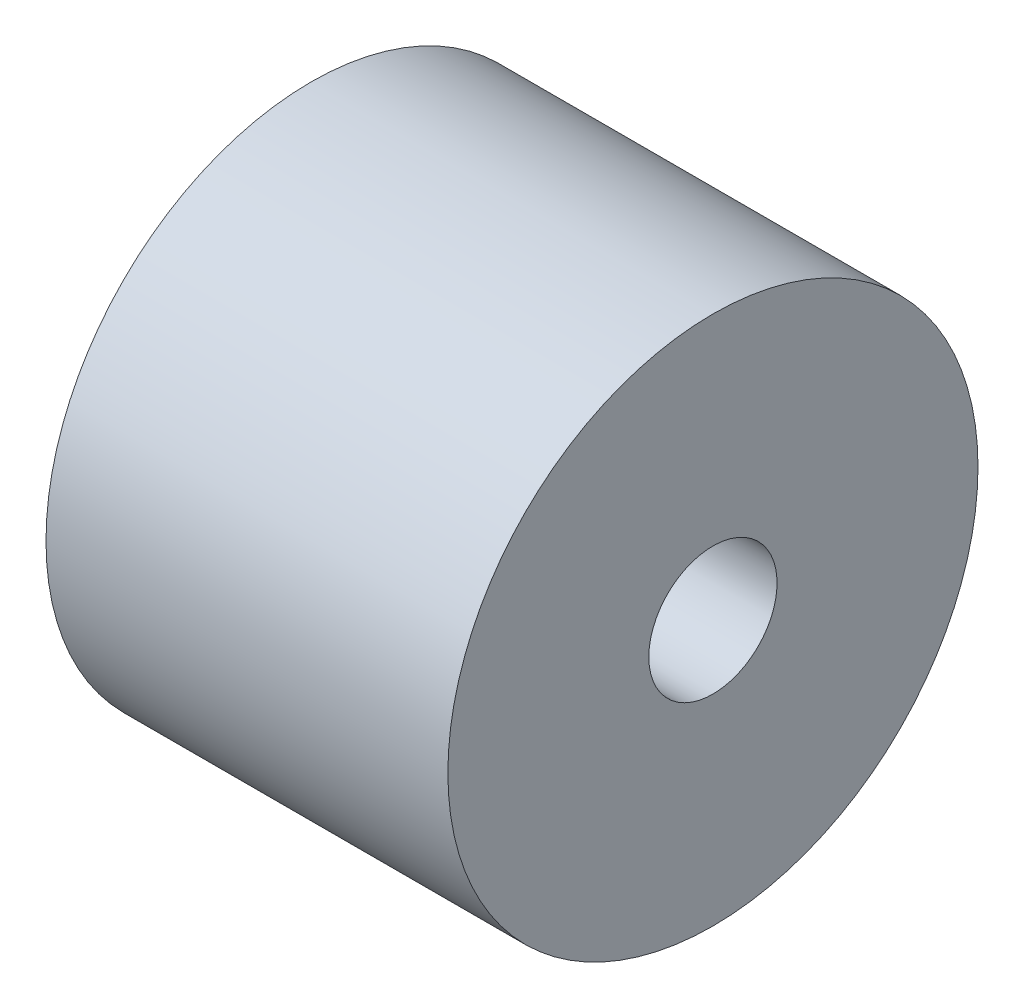
ISO-10303-21;
HEADER;
FILE_DESCRIPTION(('STEP AP214'),'2;1');
FILE_NAME('part.step','',(''),(''),'','','');
FILE_SCHEMA(('AUTOMOTIVE_DESIGN { 1 0 10303 214 1 1 1 1 }'));
ENDSEC;
DATA;
#1=APPLICATION_CONTEXT('core data for automotive mechanical design processes');
#2=APPLICATION_PROTOCOL_DEFINITION('international standard','automotive_design',2000,#1);
#3=PRODUCT_CONTEXT('',#1,'mechanical');
#4=PRODUCT('Part','Part','',(#3));
#5=PRODUCT_RELATED_PRODUCT_CATEGORY('part','',(#4));
#6=PRODUCT_DEFINITION_FORMATION('','',#4);
#7=PRODUCT_DEFINITION_CONTEXT('part definition',#1,'design');
#8=PRODUCT_DEFINITION('design','',#6,#7);
#9=PRODUCT_DEFINITION_SHAPE('','',#8);
#10=(LENGTH_UNIT() NAMED_UNIT(*) SI_UNIT(.MILLI.,.METRE.));
#11=(NAMED_UNIT(*) PLANE_ANGLE_UNIT() SI_UNIT($,.RADIAN.));
#12=(NAMED_UNIT(*) SI_UNIT($,.STERADIAN.) SOLID_ANGLE_UNIT());
#13=UNCERTAINTY_MEASURE_WITH_UNIT(LENGTH_MEASURE(1.E-05),#10,'distance_accuracy_value','');
#14=(GEOMETRIC_REPRESENTATION_CONTEXT(3) GLOBAL_UNCERTAINTY_ASSIGNED_CONTEXT((#13)) GLOBAL_UNIT_ASSIGNED_CONTEXT((#10,
#11,#12)) REPRESENTATION_CONTEXT('',''));
#15=CARTESIAN_POINT('',(0.,0.,0.));
#16=DIRECTION('',(0.,0.,1.));
#17=DIRECTION('',(1.,0.,0.));
#18=AXIS2_PLACEMENT_3D('',#15,#16,#17);
#19=CARTESIAN_POINT('',(9.4,0.,0.));
#20=DIRECTION('',(-1.,0.,0.));
#21=DIRECTION('',(0.,0.,1.));
#22=AXIS2_PLACEMENT_3D('',#19,#20,#21);
#23=CYLINDRICAL_SURFACE('',#22,6.20000000000001);
#24=CARTESIAN_POINT('',(9.4,0.,0.));
#25=DIRECTION('',(1.,0.,0.));
#26=DIRECTION('',(0.,0.,-1.));
#27=AXIS2_PLACEMENT_3D('',#24,#25,#26);
#28=CIRCLE('',#27,6.20000000000001);
#29=CARTESIAN_POINT('',(9.4,0.,-6.20000000000001));
#30=VERTEX_POINT('',#29);
#31=EDGE_CURVE('E10',#30,#30,#28,.T.);
#32=ORIENTED_EDGE('',*,*,#31,.F.);
#33=EDGE_LOOP('',(#32));
#34=FACE_BOUND('',#33,.T.);
#35=CARTESIAN_POINT('',(0.,0.,0.));
#36=DIRECTION('',(1.,0.,0.));
#37=DIRECTION('',(0.,0.,-1.));
#38=AXIS2_PLACEMENT_3D('',#35,#36,#37);
#39=CIRCLE('',#38,6.20000000000001);
#40=CARTESIAN_POINT('',(0.,0.,-6.20000000000001));
#41=VERTEX_POINT('',#40);
#42=EDGE_CURVE('E38',#41,#41,#39,.T.);
#43=ORIENTED_EDGE('',*,*,#42,.T.);
#44=EDGE_LOOP('',(#43));
#45=FACE_BOUND('',#44,.T.);
#46=ADVANCED_FACE('F35',(#34,#45),#23,.T.);
#47=CARTESIAN_POINT('',(9.4,0.,0.));
#48=DIRECTION('',(1.,0.,0.));
#49=DIRECTION('',(0.,0.,-1.));
#50=AXIS2_PLACEMENT_3D('',#47,#48,#49);
#51=PLANE('',#50);
#52=CARTESIAN_POINT('',(9.4,0.,0.));
#53=DIRECTION('',(-1.,0.,0.));
#54=DIRECTION('',(0.,0.,1.));
#55=AXIS2_PLACEMENT_3D('',#52,#53,#54);
#56=CIRCLE('',#55,1.5);
#57=CARTESIAN_POINT('',(9.4,0.,1.5));
#58=VERTEX_POINT('',#57);
#59=EDGE_CURVE('E45',#58,#58,#56,.T.);
#60=ORIENTED_EDGE('',*,*,#59,.T.);
#61=EDGE_LOOP('',(#60));
#62=FACE_BOUND('',#61,.T.);
#63=ORIENTED_EDGE('',*,*,#31,.T.);
#64=EDGE_LOOP('',(#63));
#65=FACE_BOUND('',#64,.T.);
#66=ADVANCED_FACE('F53',(#62,#65),#51,.T.);
#67=CARTESIAN_POINT('',(0.,0.,0.));
#68=DIRECTION('',(1.,0.,0.));
#69=DIRECTION('',(0.,0.,-1.));
#70=AXIS2_PLACEMENT_3D('',#67,#68,#69);
#71=PLANE('',#70);
#72=CARTESIAN_POINT('',(0.,0.,0.));
#73=DIRECTION('',(-1.,0.,0.));
#74=DIRECTION('',(0.,0.,1.));
#75=AXIS2_PLACEMENT_3D('',#72,#73,#74);
#76=CIRCLE('',#75,1.5);
#77=CARTESIAN_POINT('',(0.,0.,1.5));
#78=VERTEX_POINT('',#77);
#79=EDGE_CURVE('E47',#78,#78,#76,.T.);
#80=ORIENTED_EDGE('',*,*,#79,.F.);
#81=EDGE_LOOP('',(#80));
#82=FACE_BOUND('',#81,.T.);
#83=ORIENTED_EDGE('',*,*,#42,.F.);
#84=EDGE_LOOP('',(#83));
#85=FACE_BOUND('',#84,.T.);
#86=ADVANCED_FACE('F58',(#82,#85),#71,.F.);
#87=CARTESIAN_POINT('',(9.4,0.,0.));
#88=DIRECTION('',(-1.,0.,0.));
#89=DIRECTION('',(0.,0.,1.));
#90=AXIS2_PLACEMENT_3D('',#87,#88,#89);
#91=CYLINDRICAL_SURFACE('',#90,1.5);
#92=ORIENTED_EDGE('',*,*,#59,.F.);
#93=EDGE_LOOP('',(#92));
#94=FACE_BOUND('',#93,.T.);
#95=ORIENTED_EDGE('',*,*,#79,.T.);
#96=EDGE_LOOP('',(#95));
#97=FACE_BOUND('',#96,.T.);
#98=ADVANCED_FACE('F55',(#94,#97),#91,.F.);
#99=CLOSED_SHELL('',(#46,#66,#86,#98));
#100=MANIFOLD_SOLID_BREP('B2',#99);
#101=ADVANCED_BREP_SHAPE_REPRESENTATION('',(#18,#100),#14);
#102=SHAPE_DEFINITION_REPRESENTATION(#9,#101);
ENDSEC;
END-ISO-10303-21;
